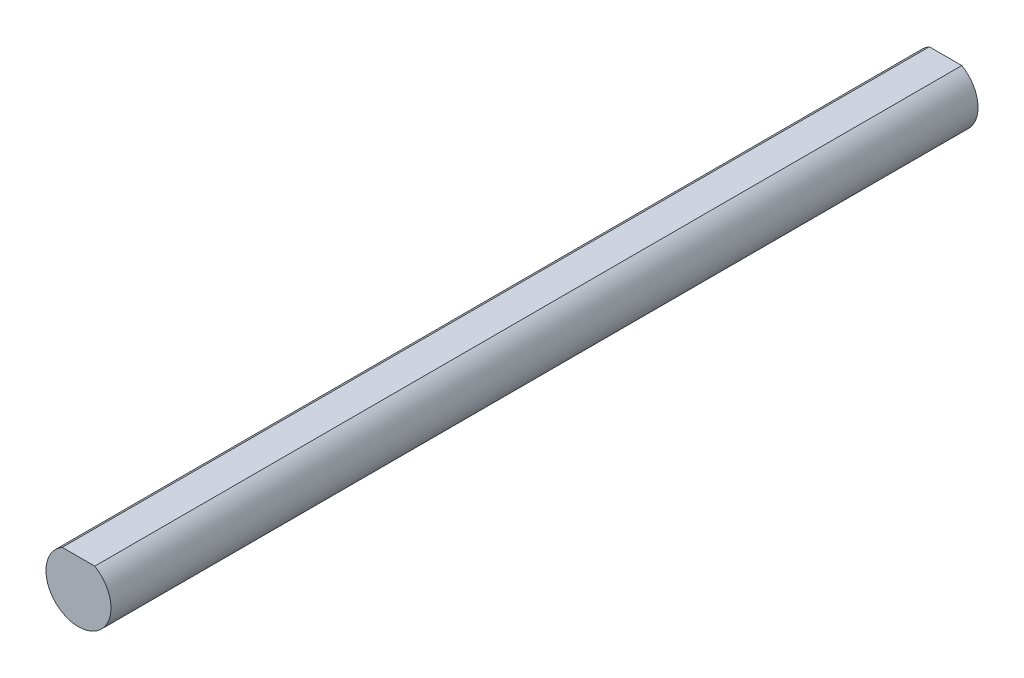
ISO-10303-21;
HEADER;
FILE_DESCRIPTION(('STEP AP214'),'2;1');
FILE_NAME('part.step','',(''),(''),'','','');
FILE_SCHEMA(('AUTOMOTIVE_DESIGN { 1 0 10303 214 1 1 1 1 }'));
ENDSEC;
DATA;
#1=APPLICATION_CONTEXT('core data for automotive mechanical design processes');
#2=APPLICATION_PROTOCOL_DEFINITION('international standard','automotive_design',2000,#1);
#3=PRODUCT_CONTEXT('',#1,'mechanical');
#4=PRODUCT('Part','Part','',(#3));
#5=PRODUCT_RELATED_PRODUCT_CATEGORY('part','',(#4));
#6=PRODUCT_DEFINITION_FORMATION('','',#4);
#7=PRODUCT_DEFINITION_CONTEXT('part definition',#1,'design');
#8=PRODUCT_DEFINITION('design','',#6,#7);
#9=PRODUCT_DEFINITION_SHAPE('','',#8);
#10=(LENGTH_UNIT() NAMED_UNIT(*) SI_UNIT(.MILLI.,.METRE.));
#11=(NAMED_UNIT(*) PLANE_ANGLE_UNIT() SI_UNIT($,.RADIAN.));
#12=(NAMED_UNIT(*) SI_UNIT($,.STERADIAN.) SOLID_ANGLE_UNIT());
#13=UNCERTAINTY_MEASURE_WITH_UNIT(LENGTH_MEASURE(1.E-05),#10,'distance_accuracy_value','');
#14=(GEOMETRIC_REPRESENTATION_CONTEXT(3) GLOBAL_UNCERTAINTY_ASSIGNED_CONTEXT((#13)) GLOBAL_UNIT_ASSIGNED_CONTEXT((#10,
#11,#12)) REPRESENTATION_CONTEXT('',''));
#15=CARTESIAN_POINT('',(0.,0.,0.));
#16=DIRECTION('',(0.,0.,1.));
#17=DIRECTION('',(1.,0.,0.));
#18=AXIS2_PLACEMENT_3D('',#15,#16,#17);
#19=CARTESIAN_POINT('',(0.,0.,80.));
#20=DIRECTION('',(0.,0.,-1.));
#21=DIRECTION('',(-1.,0.,0.));
#22=AXIS2_PLACEMENT_3D('',#19,#20,#21);
#23=CYLINDRICAL_SURFACE('',#22,3.);
#24=CARTESIAN_POINT('',(0.,0.,0.));
#25=DIRECTION('',(0.,0.,1.));
#26=DIRECTION('',(1.,0.,0.));
#27=AXIS2_PLACEMENT_3D('',#24,#25,#26);
#28=CIRCLE('',#27,3.);
#29=CARTESIAN_POINT('',(-1.5,2.59807621135332,0.));
#30=VERTEX_POINT('',#29);
#31=CARTESIAN_POINT('',(1.5,2.59807621135332,0.));
#32=VERTEX_POINT('',#31);
#33=EDGE_CURVE('E67',#30,#32,#28,.T.);
#34=ORIENTED_EDGE('',*,*,#33,.T.);
#35=DIRECTION('',(0.,0.,-1.));
#36=VECTOR('',#35,1.);
#37=CARTESIAN_POINT('',(1.5,2.59807621135332,80.));
#38=LINE('',#37,#36);
#39=CARTESIAN_POINT('',(1.5,2.59807621135332,80.));
#40=VERTEX_POINT('',#39);
#41=EDGE_CURVE('E11',#40,#32,#38,.T.);
#42=ORIENTED_EDGE('',*,*,#41,.F.);
#43=CARTESIAN_POINT('',(0.,0.,80.));
#44=DIRECTION('',(0.,0.,1.));
#45=DIRECTION('',(1.,0.,0.));
#46=AXIS2_PLACEMENT_3D('',#43,#44,#45);
#47=CIRCLE('',#46,3.);
#48=CARTESIAN_POINT('',(-1.5,2.59807621135332,80.));
#49=VERTEX_POINT('',#48);
#50=EDGE_CURVE('E66',#49,#40,#47,.T.);
#51=ORIENTED_EDGE('',*,*,#50,.F.);
#52=DIRECTION('',(0.,0.,-1.));
#53=VECTOR('',#52,1.);
#54=CARTESIAN_POINT('',(-1.5,2.59807621135332,80.));
#55=LINE('',#54,#53);
#56=EDGE_CURVE('E44',#49,#30,#55,.T.);
#57=ORIENTED_EDGE('',*,*,#56,.T.);
#58=EDGE_LOOP('',(#34,#42,#51,#57));
#59=FACE_BOUND('',#58,.T.);
#60=ADVANCED_FACE('F36',(#59),#23,.T.);
#61=CARTESIAN_POINT('',(-1.5,2.59807621135332,80.));
#62=DIRECTION('',(0.,-1.,0.));
#63=DIRECTION('',(0.,0.,-1.));
#64=AXIS2_PLACEMENT_3D('',#61,#62,#63);
#65=PLANE('',#64);
#66=DIRECTION('',(-1.,0.,0.));
#67=VECTOR('',#66,1.);
#68=CARTESIAN_POINT('',(-1.5,2.59807621135332,0.));
#69=LINE('',#68,#67);
#70=EDGE_CURVE('E59',#32,#30,#69,.T.);
#71=ORIENTED_EDGE('',*,*,#70,.T.);
#72=ORIENTED_EDGE('',*,*,#56,.F.);
#73=DIRECTION('',(-1.,0.,0.));
#74=VECTOR('',#73,1.);
#75=CARTESIAN_POINT('',(-1.5,2.59807621135332,80.));
#76=LINE('',#75,#74);
#77=EDGE_CURVE('E51',#40,#49,#76,.T.);
#78=ORIENTED_EDGE('',*,*,#77,.F.);
#79=ORIENTED_EDGE('',*,*,#41,.T.);
#80=EDGE_LOOP('',(#71,#72,#78,#79));
#81=FACE_BOUND('',#80,.T.);
#82=ADVANCED_FACE('F62',(#81),#65,.F.);
#83=CARTESIAN_POINT('',(0.,0.,80.));
#84=DIRECTION('',(0.,0.,1.));
#85=DIRECTION('',(1.,0.,0.));
#86=AXIS2_PLACEMENT_3D('',#83,#84,#85);
#87=PLANE('',#86);
#88=ORIENTED_EDGE('',*,*,#50,.T.);
#89=ORIENTED_EDGE('',*,*,#77,.T.);
#90=EDGE_LOOP('',(#88,#89));
#91=FACE_BOUND('',#90,.T.);
#92=ADVANCED_FACE('F74',(#91),#87,.T.);
#93=CARTESIAN_POINT('',(0.,0.,0.));
#94=DIRECTION('',(0.,0.,1.));
#95=DIRECTION('',(1.,0.,0.));
#96=AXIS2_PLACEMENT_3D('',#93,#94,#95);
#97=PLANE('',#96);
#98=ORIENTED_EDGE('',*,*,#33,.F.);
#99=ORIENTED_EDGE('',*,*,#70,.F.);
#100=EDGE_LOOP('',(#98,#99));
#101=FACE_BOUND('',#100,.T.);
#102=ADVANCED_FACE('F70',(#101),#97,.F.);
#103=CLOSED_SHELL('',(#60,#82,#92,#102));
#104=MANIFOLD_SOLID_BREP('B2',#103);
#105=ADVANCED_BREP_SHAPE_REPRESENTATION('',(#18,#104),#14);
#106=SHAPE_DEFINITION_REPRESENTATION(#9,#105);
ENDSEC;
END-ISO-10303-21;
